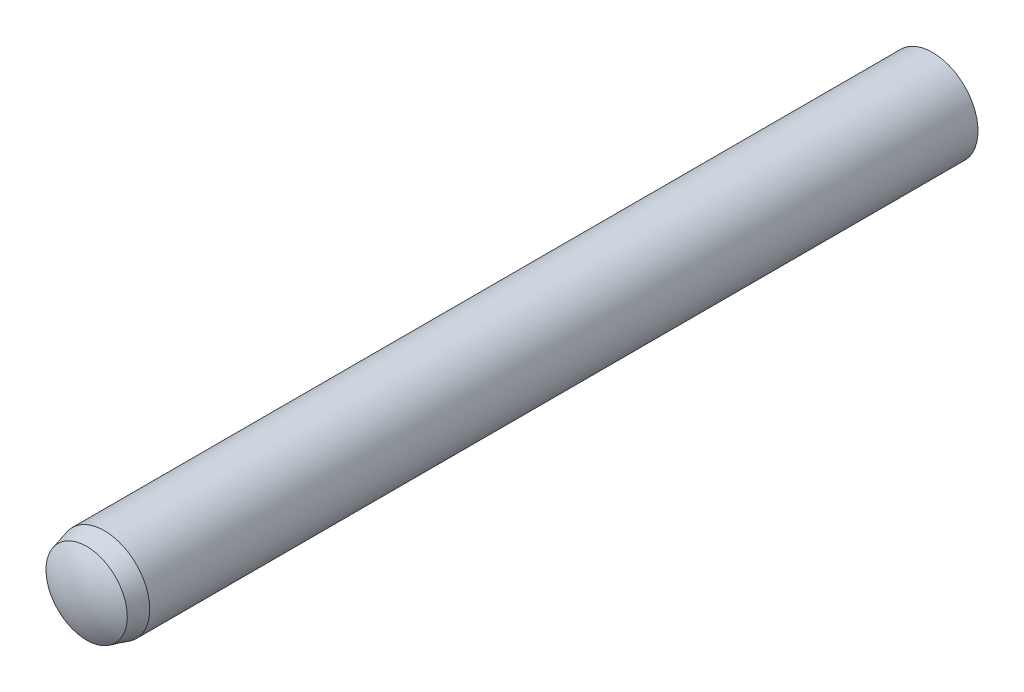
ISO-10303-21;
HEADER;
FILE_DESCRIPTION(('STEP AP214'),'2;1');
FILE_NAME('part.step','',(''),(''),'','','');
FILE_SCHEMA(('AUTOMOTIVE_DESIGN { 1 0 10303 214 1 1 1 1 }'));
ENDSEC;
DATA;
#1=APPLICATION_CONTEXT('core data for automotive mechanical design processes');
#2=APPLICATION_PROTOCOL_DEFINITION('international standard','automotive_design',2000,#1);
#3=PRODUCT_CONTEXT('',#1,'mechanical');
#4=PRODUCT('Part','Part','',(#3));
#5=PRODUCT_RELATED_PRODUCT_CATEGORY('part','',(#4));
#6=PRODUCT_DEFINITION_FORMATION('','',#4);
#7=PRODUCT_DEFINITION_CONTEXT('part definition',#1,'design');
#8=PRODUCT_DEFINITION('design','',#6,#7);
#9=PRODUCT_DEFINITION_SHAPE('','',#8);
#10=(LENGTH_UNIT() NAMED_UNIT(*) SI_UNIT(.MILLI.,.METRE.));
#11=(NAMED_UNIT(*) PLANE_ANGLE_UNIT() SI_UNIT($,.RADIAN.));
#12=(NAMED_UNIT(*) SI_UNIT($,.STERADIAN.) SOLID_ANGLE_UNIT());
#13=UNCERTAINTY_MEASURE_WITH_UNIT(LENGTH_MEASURE(1.E-05),#10,'distance_accuracy_value','');
#14=(GEOMETRIC_REPRESENTATION_CONTEXT(3) GLOBAL_UNCERTAINTY_ASSIGNED_CONTEXT((#13)) GLOBAL_UNIT_ASSIGNED_CONTEXT((#10,
#11,#12)) REPRESENTATION_CONTEXT('',''));
#15=CARTESIAN_POINT('',(0.,0.,0.));
#16=DIRECTION('',(0.,0.,1.));
#17=DIRECTION('',(1.,0.,0.));
#18=AXIS2_PLACEMENT_3D('',#15,#16,#17);
#19=CARTESIAN_POINT('',(0.,0.,-9.72916666666668));
#20=DIRECTION('',(0.,0.,1.));
#21=DIRECTION('',(0.,1.,0.));
#22=AXIS2_PLACEMENT_3D('',#19,#20,#21);
#23=SPHERICAL_SURFACE('',#22,2.27083333333332);
#24=CARTESIAN_POINT('',(0.,0.,-11.625));
#25=DIRECTION('',(0.,0.,1.));
#26=DIRECTION('',(0.,-1.,0.));
#27=AXIS2_PLACEMENT_3D('',#24,#25,#26);
#28=CIRCLE('',#27,1.25);
#29=CARTESIAN_POINT('',(0.,-1.24999999999999,-11.625));
#30=VERTEX_POINT('',#29);
#31=EDGE_CURVE('E10',#30,#30,#28,.T.);
#32=ORIENTED_EDGE('',*,*,#31,.F.);
#33=EDGE_LOOP('',(#32));
#34=FACE_BOUND('',#33,.T.);
#35=ADVANCED_FACE('F39',(#34),#23,.T.);
#36=CARTESIAN_POINT('',(0.,0.,12.));
#37=DIRECTION('',(0.,0.,1.));
#38=DIRECTION('',(0.,-1.,0.));
#39=AXIS2_PLACEMENT_3D('',#36,#37,#38);
#40=CYLINDRICAL_SURFACE('',#39,1.25);
#41=CARTESIAN_POINT('',(0.,0.,11.1875));
#42=DIRECTION('',(0.,0.,1.));
#43=DIRECTION('',(0.,-1.,0.));
#44=AXIS2_PLACEMENT_3D('',#41,#42,#43);
#45=CIRCLE('',#44,1.25);
#46=CARTESIAN_POINT('',(0.,-1.25,11.1875));
#47=VERTEX_POINT('',#46);
#48=EDGE_CURVE('E46',#47,#47,#45,.T.);
#49=ORIENTED_EDGE('',*,*,#48,.F.);
#50=EDGE_LOOP('',(#49));
#51=FACE_BOUND('',#50,.T.);
#52=ORIENTED_EDGE('',*,*,#31,.T.);
#53=EDGE_LOOP('',(#52));
#54=FACE_BOUND('',#53,.T.);
#55=ADVANCED_FACE('F63',(#51,#54),#40,.T.);
#56=CARTESIAN_POINT('',(0.,0.,11.1875));
#57=DIRECTION('',(0.,0.,-1.));
#58=DIRECTION('',(0.,1.,0.));
#59=AXIS2_PLACEMENT_3D('',#56,#57,#58);
#60=CONICAL_SURFACE('',#59,1.25,0.26179938779915);
#61=CARTESIAN_POINT('',(0.,0.,11.675));
#62=DIRECTION('',(0.,0.,1.));
#63=DIRECTION('',(0.,-1.,0.));
#64=AXIS2_PLACEMENT_3D('',#61,#62,#63);
#65=CIRCLE('',#64,1.11937476868983);
#66=CARTESIAN_POINT('',(0.,-1.11937476868983,11.675));
#67=VERTEX_POINT('',#66);
#68=EDGE_CURVE('E51',#67,#67,#65,.T.);
#69=ORIENTED_EDGE('',*,*,#68,.F.);
#70=EDGE_LOOP('',(#69));
#71=FACE_BOUND('',#70,.T.);
#72=ORIENTED_EDGE('',*,*,#48,.T.);
#73=EDGE_LOOP('',(#72));
#74=FACE_BOUND('',#73,.T.);
#75=ADVANCED_FACE('F61',(#71,#74),#60,.T.);
#76=CARTESIAN_POINT('',(0.,0.,9.90980788803169));
#77=DIRECTION('',(0.,0.,1.));
#78=DIRECTION('',(0.,1.,0.));
#79=AXIS2_PLACEMENT_3D('',#76,#77,#78);
#80=SPHERICAL_SURFACE('',#79,2.09019211196831);
#81=ORIENTED_EDGE('',*,*,#68,.T.);
#82=EDGE_LOOP('',(#81));
#83=FACE_BOUND('',#82,.T.);
#84=ADVANCED_FACE('F59',(#83),#80,.T.);
#85=CLOSED_SHELL('',(#35,#55,#75,#84));
#86=MANIFOLD_SOLID_BREP('B2',#85);
#87=ADVANCED_BREP_SHAPE_REPRESENTATION('',(#18,#86),#14);
#88=SHAPE_DEFINITION_REPRESENTATION(#9,#87);
ENDSEC;
END-ISO-10303-21;
